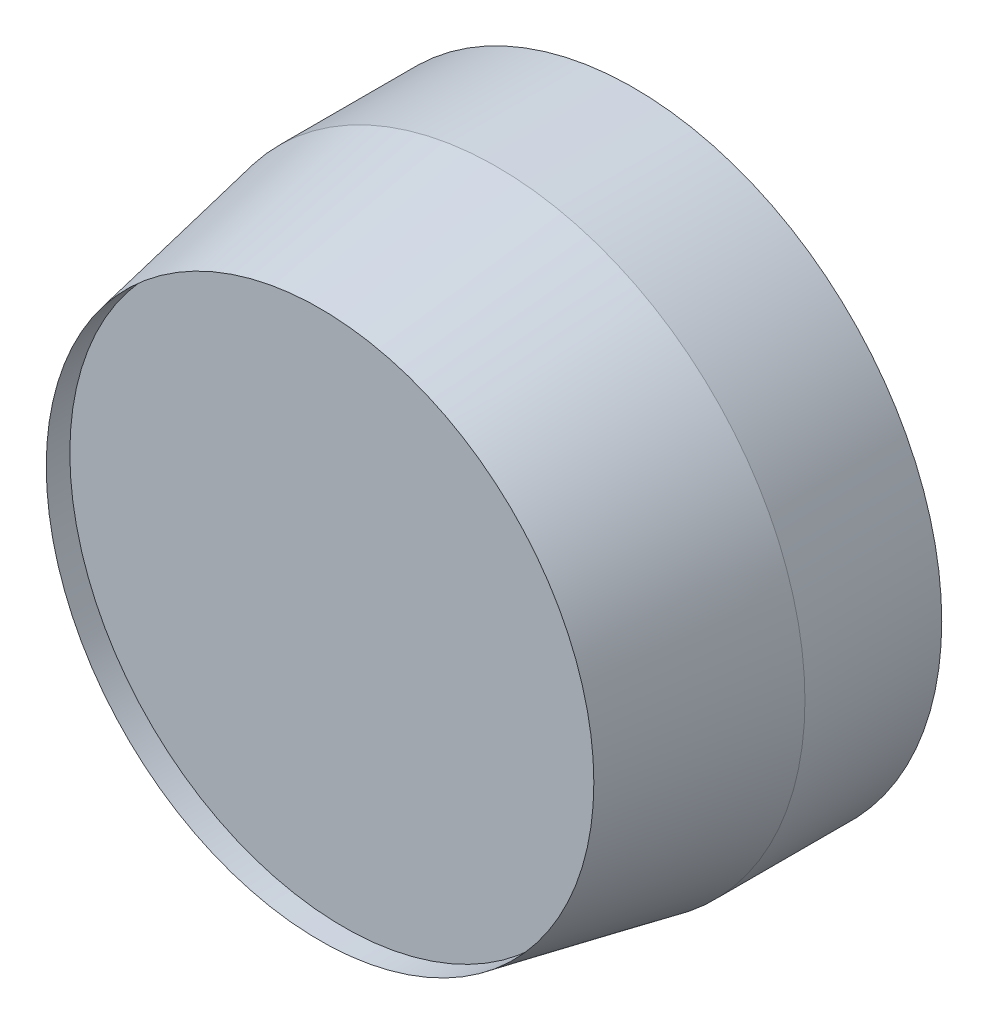
ISO-10303-21;
HEADER;
FILE_DESCRIPTION(('STEP AP214'),'2;1');
FILE_NAME('part.step','',(''),(''),'','','');
FILE_SCHEMA(('AUTOMOTIVE_DESIGN { 1 0 10303 214 1 1 1 1 }'));
ENDSEC;
DATA;
#1=APPLICATION_CONTEXT('core data for automotive mechanical design processes');
#2=APPLICATION_PROTOCOL_DEFINITION('international standard','automotive_design',2000,#1);
#3=PRODUCT_CONTEXT('',#1,'mechanical');
#4=PRODUCT('Part','Part','',(#3));
#5=PRODUCT_RELATED_PRODUCT_CATEGORY('part','',(#4));
#6=PRODUCT_DEFINITION_FORMATION('','',#4);
#7=PRODUCT_DEFINITION_CONTEXT('part definition',#1,'design');
#8=PRODUCT_DEFINITION('design','',#6,#7);
#9=PRODUCT_DEFINITION_SHAPE('','',#8);
#10=(LENGTH_UNIT() NAMED_UNIT(*) SI_UNIT(.MILLI.,.METRE.));
#11=(NAMED_UNIT(*) PLANE_ANGLE_UNIT() SI_UNIT($,.RADIAN.));
#12=(NAMED_UNIT(*) SI_UNIT($,.STERADIAN.) SOLID_ANGLE_UNIT());
#13=UNCERTAINTY_MEASURE_WITH_UNIT(LENGTH_MEASURE(1.E-05),#10,'distance_accuracy_value','');
#14=(GEOMETRIC_REPRESENTATION_CONTEXT(3) GLOBAL_UNCERTAINTY_ASSIGNED_CONTEXT((#13)) GLOBAL_UNIT_ASSIGNED_CONTEXT((#10,
#11,#12)) REPRESENTATION_CONTEXT('',''));
#15=CARTESIAN_POINT('',(0.,0.,0.));
#16=DIRECTION('',(0.,0.,1.));
#17=DIRECTION('',(1.,0.,0.));
#18=AXIS2_PLACEMENT_3D('',#15,#16,#17);
#19=CARTESIAN_POINT('',(-9.17033988574775,25.3261280781354,-274.646639488526));
#20=DIRECTION('',(0.,0.,1.));
#21=DIRECTION('',(1.,0.,0.));
#22=AXIS2_PLACEMENT_3D('',#19,#20,#21);
#23=CYLINDRICAL_SURFACE('',#22,431.180769537696);
#24=CARTESIAN_POINT('',(-9.17033988574775,25.3261280781354,-274.646639488526));
#25=DIRECTION('',(0.,0.,1.));
#26=DIRECTION('',(1.,0.,0.));
#27=AXIS2_PLACEMENT_3D('',#24,#25,#26);
#28=CIRCLE('',#27,431.180769537696);
#29=CARTESIAN_POINT('',(422.010429651948,25.3261280781354,-274.646639488526));
#30=VERTEX_POINT('',#29);
#31=EDGE_CURVE('E11',#30,#30,#28,.T.);
#32=ORIENTED_EDGE('',*,*,#31,.T.);
#33=EDGE_LOOP('',(#32));
#34=FACE_BOUND('',#33,.T.);
#35=CARTESIAN_POINT('',(-9.17033988574775,25.3261280781354,-83.1306394885267));
#36=DIRECTION('',(0.,0.,1.));
#37=DIRECTION('',(1.,0.,0.));
#38=AXIS2_PLACEMENT_3D('',#35,#36,#37);
#39=CIRCLE('',#38,431.180769537696);
#40=CARTESIAN_POINT('',(422.010429651948,25.3261280781355,-83.1306394885267));
#41=VERTEX_POINT('',#40);
#42=EDGE_CURVE('E52',#41,#41,#39,.T.);
#43=ORIENTED_EDGE('',*,*,#42,.F.);
#44=EDGE_LOOP('',(#43));
#45=FACE_BOUND('',#44,.T.);
#46=ADVANCED_FACE('F42',(#34,#45),#23,.T.);
#47=CARTESIAN_POINT('',(-9.17033988574775,25.3261280781354,-274.646639488526));
#48=DIRECTION('',(0.,0.,1.));
#49=DIRECTION('',(1.,0.,0.));
#50=AXIS2_PLACEMENT_3D('',#47,#48,#49);
#51=PLANE('',#50);
#52=CARTESIAN_POINT('',(-9.17033988574775,25.3261280781354,-274.646639488526));
#53=DIRECTION('',(0.,0.,1.));
#54=DIRECTION('',(1.,0.,0.));
#55=AXIS2_PLACEMENT_3D('',#52,#53,#54);
#56=CIRCLE('',#55,414.407940027986);
#57=CARTESIAN_POINT('',(405.237600142238,25.3261280781354,-274.646639488526));
#58=VERTEX_POINT('',#57);
#59=EDGE_CURVE('E57',#58,#58,#56,.T.);
#60=ORIENTED_EDGE('',*,*,#59,.T.);
#61=EDGE_LOOP('',(#60));
#62=FACE_BOUND('',#61,.T.);
#63=ORIENTED_EDGE('',*,*,#31,.F.);
#64=EDGE_LOOP('',(#63));
#65=FACE_BOUND('',#64,.T.);
#66=ADVANCED_FACE('F115',(#62,#65),#51,.F.);
#67=CARTESIAN_POINT('',(-9.17033988574775,25.3261280781354,-274.646639488526));
#68=DIRECTION('',(0.,0.,1.));
#69=DIRECTION('',(1.,0.,0.));
#70=AXIS2_PLACEMENT_3D('',#67,#68,#69);
#71=CYLINDRICAL_SURFACE('',#70,414.407940027986);
#72=CARTESIAN_POINT('',(-9.17033988574775,25.3261280781354,-83.1306394885267));
#73=DIRECTION('',(0.,0.,1.));
#74=DIRECTION('',(1.,0.,0.));
#75=AXIS2_PLACEMENT_3D('',#72,#73,#74);
#76=CIRCLE('',#75,414.407940027986);
#77=CARTESIAN_POINT('',(405.237600142238,25.3261280781354,-83.1306394885267));
#78=VERTEX_POINT('',#77);
#79=EDGE_CURVE('E60',#78,#78,#76,.T.);
#80=CARTESIAN_POINT('',(405.237600142238,25.3261280781354,-274.646639488526));
#81=CARTESIAN_POINT('',(405.237600142238,25.3261280781354,-272.651681155193));
#82=CARTESIAN_POINT('',(405.237600142238,25.3261280781354,-270.65672282186));
#83=CARTESIAN_POINT('',(405.237600142238,25.3261280781354,-266.666806155193));
#84=CARTESIAN_POINT('',(405.237600142238,25.3261280781354,-264.67184782186));
#85=CARTESIAN_POINT('',(405.237600142238,25.3261280781354,-260.681931155193));
#86=CARTESIAN_POINT('',(405.237600142238,25.3261280781354,-258.68697282186));
#87=CARTESIAN_POINT('',(405.237600142238,25.3261280781354,-254.697056155193));
#88=CARTESIAN_POINT('',(405.237600142238,25.3261280781354,-252.70209782186));
#89=CARTESIAN_POINT('',(405.237600142238,25.3261280781354,-248.712181155193));
#90=CARTESIAN_POINT('',(405.237600142238,25.3261280781354,-246.71722282186));
#91=CARTESIAN_POINT('',(405.237600142238,25.3261280781354,-242.727306155193));
#92=CARTESIAN_POINT('',(405.237600142238,25.3261280781354,-240.73234782186));
#93=CARTESIAN_POINT('',(405.237600142238,25.3261280781354,-236.742431155193));
#94=CARTESIAN_POINT('',(405.237600142238,25.3261280781354,-234.74747282186));
#95=CARTESIAN_POINT('',(405.237600142238,25.3261280781354,-230.757556155193));
#96=CARTESIAN_POINT('',(405.237600142238,25.3261280781354,-228.76259782186));
#97=CARTESIAN_POINT('',(405.237600142238,25.3261280781354,-224.772681155193));
#98=CARTESIAN_POINT('',(405.237600142238,25.3261280781354,-222.77772282186));
#99=CARTESIAN_POINT('',(405.237600142238,25.3261280781354,-218.787806155193));
#100=CARTESIAN_POINT('',(405.237600142238,25.3261280781354,-216.79284782186));
#101=CARTESIAN_POINT('',(405.237600142238,25.3261280781354,-212.802931155193));
#102=CARTESIAN_POINT('',(405.237600142238,25.3261280781354,-210.80797282186));
#103=CARTESIAN_POINT('',(405.237600142238,25.3261280781354,-206.818056155193));
#104=CARTESIAN_POINT('',(405.237600142238,25.3261280781354,-204.82309782186));
#105=CARTESIAN_POINT('',(405.237600142238,25.3261280781354,-200.833181155193));
#106=CARTESIAN_POINT('',(405.237600142238,25.3261280781354,-198.83822282186));
#107=CARTESIAN_POINT('',(405.237600142238,25.3261280781354,-194.848306155193));
#108=CARTESIAN_POINT('',(405.237600142238,25.3261280781354,-192.85334782186));
#109=CARTESIAN_POINT('',(405.237600142238,25.3261280781354,-188.863431155193));
#110=CARTESIAN_POINT('',(405.237600142238,25.3261280781354,-186.86847282186));
#111=CARTESIAN_POINT('',(405.237600142238,25.3261280781354,-182.878556155193));
#112=CARTESIAN_POINT('',(405.237600142238,25.3261280781354,-180.88359782186));
#113=CARTESIAN_POINT('',(405.237600142238,25.3261280781354,-176.893681155193));
#114=CARTESIAN_POINT('',(405.237600142238,25.3261280781354,-174.89872282186));
#115=CARTESIAN_POINT('',(405.237600142238,25.3261280781354,-170.908806155193));
#116=CARTESIAN_POINT('',(405.237600142238,25.3261280781354,-168.91384782186));
#117=CARTESIAN_POINT('',(405.237600142238,25.3261280781354,-164.923931155193));
#118=CARTESIAN_POINT('',(405.237600142238,25.3261280781354,-162.92897282186));
#119=CARTESIAN_POINT('',(405.237600142238,25.3261280781354,-158.939056155193));
#120=CARTESIAN_POINT('',(405.237600142238,25.3261280781354,-156.94409782186));
#121=CARTESIAN_POINT('',(405.237600142238,25.3261280781354,-152.954181155193));
#122=CARTESIAN_POINT('',(405.237600142238,25.3261280781354,-150.95922282186));
#123=CARTESIAN_POINT('',(405.237600142238,25.3261280781354,-146.969306155193));
#124=CARTESIAN_POINT('',(405.237600142238,25.3261280781354,-144.97434782186));
#125=CARTESIAN_POINT('',(405.237600142238,25.3261280781354,-140.984431155193));
#126=CARTESIAN_POINT('',(405.237600142238,25.3261280781354,-138.98947282186));
#127=CARTESIAN_POINT('',(405.237600142238,25.3261280781354,-134.999556155193));
#128=CARTESIAN_POINT('',(405.237600142238,25.3261280781354,-133.00459782186));
#129=CARTESIAN_POINT('',(405.237600142238,25.3261280781354,-129.014681155193));
#130=CARTESIAN_POINT('',(405.237600142238,25.3261280781354,-127.01972282186));
#131=CARTESIAN_POINT('',(405.237600142238,25.3261280781354,-123.029806155193));
#132=CARTESIAN_POINT('',(405.237600142238,25.3261280781354,-121.03484782186));
#133=CARTESIAN_POINT('',(405.237600142238,25.3261280781354,-117.044931155193));
#134=CARTESIAN_POINT('',(405.237600142238,25.3261280781354,-115.04997282186));
#135=CARTESIAN_POINT('',(405.237600142238,25.3261280781354,-111.060056155193));
#136=CARTESIAN_POINT('',(405.237600142238,25.3261280781354,-109.06509782186));
#137=CARTESIAN_POINT('',(405.237600142238,25.3261280781354,-105.075181155193));
#138=CARTESIAN_POINT('',(405.237600142238,25.3261280781354,-103.08022282186));
#139=CARTESIAN_POINT('',(405.237600142238,25.3261280781354,-99.0903061551933));
#140=CARTESIAN_POINT('',(405.237600142238,25.3261280781354,-97.09534782186));
#141=CARTESIAN_POINT('',(405.237600142238,25.3261280781354,-93.1054311551933));
#142=CARTESIAN_POINT('',(405.237600142238,25.3261280781354,-91.11047282186));
#143=CARTESIAN_POINT('',(405.237600142238,25.3261280781354,-87.1205561551933));
#144=CARTESIAN_POINT('',(405.237600142238,25.3261280781354,-85.12559782186));
#145=CARTESIAN_POINT('',(405.237600142238,25.3261280781354,-83.1306394885267));
#146=B_SPLINE_CURVE_WITH_KNOTS('',3,(#80,#81,#82,#83,#84,#85,#86,#87,#88,#89,#90,#91,#92,#93,
#94,#95,#96,#97,#98,#99,#100,#101,#102,#103,#104,#105,#106,#107,#108,#109,#110,#111,#112,#113,
#114,#115,#116,#117,#118,#119,#120,#121,#122,#123,#124,#125,#126,#127,#128,#129,#130,#131,#132,
#133,#134,#135,#136,#137,#138,#139,#140,#141,#142,#143,#144,#145),.UNSPECIFIED.,.F.,.F.,(4,2,2,
2,2,2,2,2,2,2,2,2,2,2,2,2,2,2,2,2,2,2,2,2,2,2,2,2,2,2,2,2,4),(0.,5.98487499999995,
11.9697499999999,17.9546249999999,23.9394999999999,29.9243749999999,35.9092499999999,
41.8941249999999,47.8789999999998,53.8638749999998,59.8487499999998,65.8336249999998,
71.8184999999998,77.8033749999998,83.7882499999998,89.7731249999997,95.7579999999997,101.742875,
107.72775,113.712625,119.6975,125.682375,131.66725,137.652125,143.637,149.621875,155.60675,
161.591625,167.5765,173.561375,179.54625,185.531125,191.515999999999),.UNSPECIFIED.);
#147=EDGE_CURVE('BSEAM118',#58,#78,#146,.T.);
#148=ORIENTED_EDGE('',*,*,#59,.F.);
#149=ORIENTED_EDGE('',*,*,#79,.T.);
#150=ORIENTED_EDGE('',*,*,#147,.T.);
#151=ORIENTED_EDGE('',*,*,#147,.F.);
#152=EDGE_LOOP('',(#148,#150,#149,#151));
#153=FACE_BOUND('',#152,.T.);
#154=ADVANCED_FACE('F118',(#153),#71,.F.);
#155=CARTESIAN_POINT('',(-9.17033988574775,25.3261280781354,-83.1306394885267));
#156=DIRECTION('',(0.,0.,1.));
#157=DIRECTION('',(1.,0.,0.));
#158=AXIS2_PLACEMENT_3D('',#155,#156,#157);
#159=PLANE('',#158);
#160=ORIENTED_EDGE('',*,*,#79,.F.);
#161=EDGE_LOOP('',(#160));
#162=FACE_BOUND('',#161,.T.);
#163=ADVANCED_FACE('F100',(#162),#159,.F.);
#164=CARTESIAN_POINT('',(-9.17033988574775,25.3261280781354,164.519360511473));
#165=DIRECTION('',(0.,0.,-1.));
#166=DIRECTION('',(-1.,0.,0.));
#167=AXIS2_PLACEMENT_3D('',#164,#165,#166);
#168=CONICAL_SURFACE('',#167,383.298809465267,0.190988684703846);
#169=CARTESIAN_POINT('',(-9.17033988574775,25.3261280781354,164.519360511473));
#170=DIRECTION('',(0.,0.,1.));
#171=DIRECTION('',(1.,0.,0.));
#172=AXIS2_PLACEMENT_3D('',#169,#170,#171);
#173=CIRCLE('',#172,383.298809465267);
#174=CARTESIAN_POINT('',(374.128469579519,25.3261280781354,164.519360511473));
#175=VERTEX_POINT('',#174);
#176=EDGE_CURVE('E75',#175,#175,#173,.T.);
#177=ORIENTED_EDGE('',*,*,#176,.F.);
#178=EDGE_LOOP('',(#177));
#179=FACE_BOUND('',#178,.T.);
#180=ORIENTED_EDGE('',*,*,#42,.T.);
#181=EDGE_LOOP('',(#180));
#182=FACE_BOUND('',#181,.T.);
#183=ADVANCED_FACE('F91',(#179,#182),#168,.T.);
#184=CARTESIAN_POINT('',(-9.17033988574775,25.3261280781354,131.499360511473));
#185=DIRECTION('',(0.,0.,1.));
#186=DIRECTION('',(1.,0.,0.));
#187=AXIS2_PLACEMENT_3D('',#184,#185,#186);
#188=CYLINDRICAL_SURFACE('',#187,383.298809465267);
#189=CARTESIAN_POINT('',(-9.17033988574775,25.3261280781354,131.499360511473));
#190=DIRECTION('',(0.,0.,1.));
#191=DIRECTION('',(1.,0.,0.));
#192=AXIS2_PLACEMENT_3D('',#189,#190,#191);
#193=CIRCLE('',#192,383.298809465267);
#194=CARTESIAN_POINT('',(374.128469579519,25.3261280781354,131.499360511473));
#195=VERTEX_POINT('',#194);
#196=EDGE_CURVE('E79',#195,#195,#193,.T.);
#197=ORIENTED_EDGE('',*,*,#196,.F.);
#198=EDGE_LOOP('',(#197));
#199=FACE_BOUND('',#198,.T.);
#200=ORIENTED_EDGE('',*,*,#176,.T.);
#201=EDGE_LOOP('',(#200));
#202=FACE_BOUND('',#201,.T.);
#203=ADVANCED_FACE('F76',(#199,#202),#188,.F.);
#204=CARTESIAN_POINT('',(-9.17033988574775,25.3261280781354,131.499360511473));
#205=DIRECTION('',(0.,0.,1.));
#206=DIRECTION('',(1.,0.,0.));
#207=AXIS2_PLACEMENT_3D('',#204,#205,#206);
#208=PLANE('',#207);
#209=ORIENTED_EDGE('',*,*,#196,.T.);
#210=EDGE_LOOP('',(#209));
#211=FACE_BOUND('',#210,.T.);
#212=ADVANCED_FACE('F158',(#211),#208,.T.);
#213=CLOSED_SHELL('',(#46,#66,#154,#163,#183,#203,#212));
#214=MANIFOLD_SOLID_BREP('B2',#213);
#215=ADVANCED_BREP_SHAPE_REPRESENTATION('',(#18,#214),#14);
#216=SHAPE_DEFINITION_REPRESENTATION(#9,#215);
ENDSEC;
END-ISO-10303-21;
